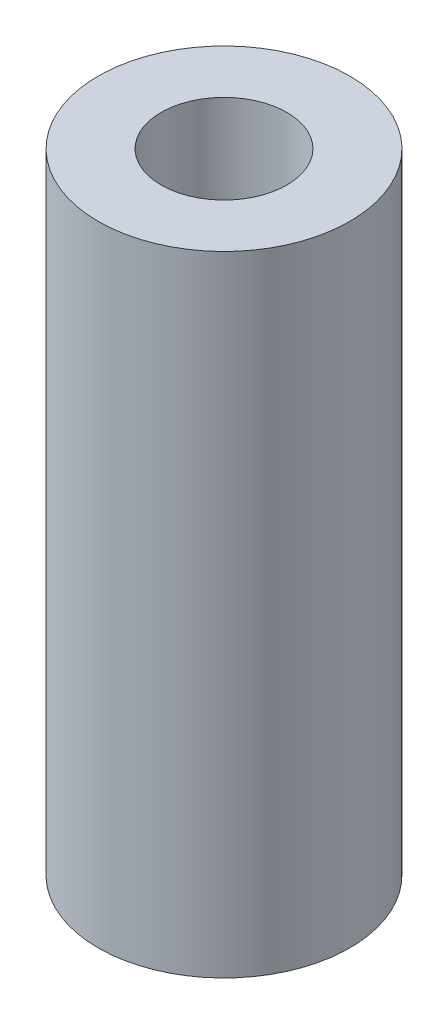
ISO-10303-21;
HEADER;
FILE_DESCRIPTION(('STEP AP214'),'2;1');
FILE_NAME('part.step','',(''),(''),'','','');
FILE_SCHEMA(('AUTOMOTIVE_DESIGN { 1 0 10303 214 1 1 1 1 }'));
ENDSEC;
DATA;
#1=APPLICATION_CONTEXT('core data for automotive mechanical design processes');
#2=APPLICATION_PROTOCOL_DEFINITION('international standard','automotive_design',2000,#1);
#3=PRODUCT_CONTEXT('',#1,'mechanical');
#4=PRODUCT('Part','Part','',(#3));
#5=PRODUCT_RELATED_PRODUCT_CATEGORY('part','',(#4));
#6=PRODUCT_DEFINITION_FORMATION('','',#4);
#7=PRODUCT_DEFINITION_CONTEXT('part definition',#1,'design');
#8=PRODUCT_DEFINITION('design','',#6,#7);
#9=PRODUCT_DEFINITION_SHAPE('','',#8);
#10=(LENGTH_UNIT() NAMED_UNIT(*) SI_UNIT(.MILLI.,.METRE.));
#11=(NAMED_UNIT(*) PLANE_ANGLE_UNIT() SI_UNIT($,.RADIAN.));
#12=(NAMED_UNIT(*) SI_UNIT($,.STERADIAN.) SOLID_ANGLE_UNIT());
#13=UNCERTAINTY_MEASURE_WITH_UNIT(LENGTH_MEASURE(1.E-05),#10,'distance_accuracy_value','');
#14=(GEOMETRIC_REPRESENTATION_CONTEXT(3) GLOBAL_UNCERTAINTY_ASSIGNED_CONTEXT((#13)) GLOBAL_UNIT_ASSIGNED_CONTEXT((#10,
#11,#12)) REPRESENTATION_CONTEXT('',''));
#15=CARTESIAN_POINT('',(0.,0.,0.));
#16=DIRECTION('',(0.,0.,1.));
#17=DIRECTION('',(1.,0.,0.));
#18=AXIS2_PLACEMENT_3D('',#15,#16,#17);
#19=CARTESIAN_POINT('',(0.,5.,0.));
#20=DIRECTION('',(0.,1.,0.));
#21=DIRECTION('',(0.,0.,1.));
#22=AXIS2_PLACEMENT_3D('',#19,#20,#21);
#23=PLANE('',#22);
#24=CARTESIAN_POINT('',(0.,5.,0.));
#25=DIRECTION('',(0.,1.,0.));
#26=DIRECTION('',(0.,0.,1.));
#27=AXIS2_PLACEMENT_3D('',#24,#25,#26);
#28=CIRCLE('',#27,1.);
#29=CARTESIAN_POINT('',(0.,5.,1.));
#30=VERTEX_POINT('',#29);
#31=EDGE_CURVE('E10',#30,#30,#28,.T.);
#32=ORIENTED_EDGE('',*,*,#31,.T.);
#33=EDGE_LOOP('',(#32));
#34=FACE_BOUND('',#33,.T.);
#35=CARTESIAN_POINT('',(0.,5.,0.));
#36=DIRECTION('',(0.,1.,0.));
#37=DIRECTION('',(0.,0.,1.));
#38=AXIS2_PLACEMENT_3D('',#35,#36,#37);
#39=CIRCLE('',#38,0.5);
#40=CARTESIAN_POINT('',(0.,5.,0.5));
#41=VERTEX_POINT('',#40);
#42=EDGE_CURVE('E46',#41,#41,#39,.T.);
#43=ORIENTED_EDGE('',*,*,#42,.F.);
#44=EDGE_LOOP('',(#43));
#45=FACE_BOUND('',#44,.T.);
#46=ADVANCED_FACE('F35',(#34,#45),#23,.T.);
#47=CARTESIAN_POINT('',(0.,0.,0.));
#48=DIRECTION('',(0.,1.,0.));
#49=DIRECTION('',(0.,0.,1.));
#50=AXIS2_PLACEMENT_3D('',#47,#48,#49);
#51=PLANE('',#50);
#52=CARTESIAN_POINT('',(0.,0.,0.));
#53=DIRECTION('',(0.,1.,0.));
#54=DIRECTION('',(0.,0.,1.));
#55=AXIS2_PLACEMENT_3D('',#52,#53,#54);
#56=CIRCLE('',#55,1.);
#57=CARTESIAN_POINT('',(0.,0.,1.));
#58=VERTEX_POINT('',#57);
#59=EDGE_CURVE('E39',#58,#58,#56,.T.);
#60=ORIENTED_EDGE('',*,*,#59,.F.);
#61=EDGE_LOOP('',(#60));
#62=FACE_BOUND('',#61,.T.);
#63=CARTESIAN_POINT('',(0.,0.,0.));
#64=DIRECTION('',(0.,1.,0.));
#65=DIRECTION('',(0.,0.,1.));
#66=AXIS2_PLACEMENT_3D('',#63,#64,#65);
#67=CIRCLE('',#66,0.5);
#68=CARTESIAN_POINT('',(0.,0.,0.5));
#69=VERTEX_POINT('',#68);
#70=EDGE_CURVE('E48',#69,#69,#67,.T.);
#71=ORIENTED_EDGE('',*,*,#70,.T.);
#72=EDGE_LOOP('',(#71));
#73=FACE_BOUND('',#72,.T.);
#74=ADVANCED_FACE('F58',(#62,#73),#51,.F.);
#75=CARTESIAN_POINT('',(0.,5.,0.));
#76=DIRECTION('',(0.,-1.,0.));
#77=DIRECTION('',(0.,0.,-1.));
#78=AXIS2_PLACEMENT_3D('',#75,#76,#77);
#79=CYLINDRICAL_SURFACE('',#78,1.);
#80=ORIENTED_EDGE('',*,*,#31,.F.);
#81=EDGE_LOOP('',(#80));
#82=FACE_BOUND('',#81,.T.);
#83=ORIENTED_EDGE('',*,*,#59,.T.);
#84=EDGE_LOOP('',(#83));
#85=FACE_BOUND('',#84,.T.);
#86=ADVANCED_FACE('F37',(#82,#85),#79,.T.);
#87=CARTESIAN_POINT('',(0.,5.,0.));
#88=DIRECTION('',(0.,-1.,0.));
#89=DIRECTION('',(0.,0.,-1.));
#90=AXIS2_PLACEMENT_3D('',#87,#88,#89);
#91=CYLINDRICAL_SURFACE('',#90,0.5);
#92=ORIENTED_EDGE('',*,*,#42,.T.);
#93=EDGE_LOOP('',(#92));
#94=FACE_BOUND('',#93,.T.);
#95=ORIENTED_EDGE('',*,*,#70,.F.);
#96=EDGE_LOOP('',(#95));
#97=FACE_BOUND('',#96,.T.);
#98=ADVANCED_FACE('F54',(#94,#97),#91,.F.);
#99=CLOSED_SHELL('',(#46,#74,#86,#98));
#100=MANIFOLD_SOLID_BREP('B2',#99);
#101=ADVANCED_BREP_SHAPE_REPRESENTATION('',(#18,#100),#14);
#102=SHAPE_DEFINITION_REPRESENTATION(#9,#101);
ENDSEC;
END-ISO-10303-21;
